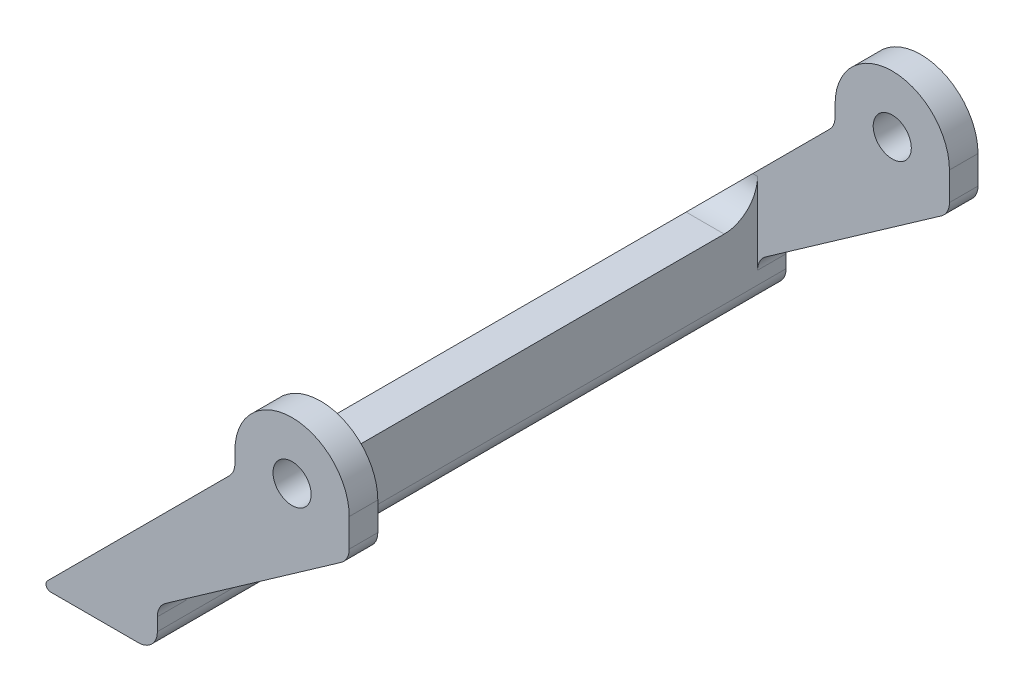
ISO-10303-21;
HEADER;
FILE_DESCRIPTION(('STEP AP214'),'2;1');
FILE_NAME('part.step','',(''),(''),'','','');
FILE_SCHEMA(('AUTOMOTIVE_DESIGN { 1 0 10303 214 1 1 1 1 }'));
ENDSEC;
DATA;
#1=APPLICATION_CONTEXT('core data for automotive mechanical design processes');
#2=APPLICATION_PROTOCOL_DEFINITION('international standard','automotive_design',2000,#1);
#3=PRODUCT_CONTEXT('',#1,'mechanical');
#4=PRODUCT('Part','Part','',(#3));
#5=PRODUCT_RELATED_PRODUCT_CATEGORY('part','',(#4));
#6=PRODUCT_DEFINITION_FORMATION('','',#4);
#7=PRODUCT_DEFINITION_CONTEXT('part definition',#1,'design');
#8=PRODUCT_DEFINITION('design','',#6,#7);
#9=PRODUCT_DEFINITION_SHAPE('','',#8);
#10=(LENGTH_UNIT() NAMED_UNIT(*) SI_UNIT(.MILLI.,.METRE.));
#11=(NAMED_UNIT(*) PLANE_ANGLE_UNIT() SI_UNIT($,.RADIAN.));
#12=(NAMED_UNIT(*) SI_UNIT($,.STERADIAN.) SOLID_ANGLE_UNIT());
#13=UNCERTAINTY_MEASURE_WITH_UNIT(LENGTH_MEASURE(1.E-05),#10,'distance_accuracy_value','');
#14=(GEOMETRIC_REPRESENTATION_CONTEXT(3) GLOBAL_UNCERTAINTY_ASSIGNED_CONTEXT((#13)) GLOBAL_UNIT_ASSIGNED_CONTEXT((#10,
#11,#12)) REPRESENTATION_CONTEXT('',''));
#15=CARTESIAN_POINT('',(0.,0.,0.));
#16=DIRECTION('',(0.,0.,1.));
#17=DIRECTION('',(1.,0.,0.));
#18=AXIS2_PLACEMENT_3D('',#15,#16,#17);
#19=CARTESIAN_POINT('',(3.336733742684,8.94083562968923,3.));
#20=DIRECTION('',(0.,0.,-1.));
#21=DIRECTION('',(-1.,0.,0.));
#22=AXIS2_PLACEMENT_3D('',#19,#20,#21);
#23=CYLINDRICAL_SURFACE('',#22,6.00000000000001);
#24=CARTESIAN_POINT('',(3.336733742684,8.94083562968923,0.));
#25=DIRECTION('',(0.,0.,1.));
#26=DIRECTION('',(-1.,0.,0.));
#27=AXIS2_PLACEMENT_3D('',#24,#25,#26);
#28=CIRCLE('',#27,6.00000000000001);
#29=CARTESIAN_POINT('',(9.33673374268399,8.94083562968921,0.));
#30=VERTEX_POINT('',#29);
#31=CARTESIAN_POINT('',(-2.66326625731602,8.94083562968921,0.));
#32=VERTEX_POINT('',#31);
#33=EDGE_CURVE('E255',#30,#32,#28,.T.);
#34=ORIENTED_EDGE('',*,*,#33,.T.);
#35=DIRECTION('',(0.,0.,-1.));
#36=VECTOR('',#35,1.);
#37=CARTESIAN_POINT('',(-2.66326625731602,8.94083562968921,3.));
#38=LINE('',#37,#36);
#39=CARTESIAN_POINT('',(-2.66326625731602,8.94083562968921,3.));
#40=VERTEX_POINT('',#39);
#41=EDGE_CURVE('E285',#40,#32,#38,.T.);
#42=ORIENTED_EDGE('',*,*,#41,.F.);
#43=CARTESIAN_POINT('',(3.336733742684,8.94083562968923,3.));
#44=DIRECTION('',(0.,0.,1.));
#45=DIRECTION('',(-1.,0.,0.));
#46=AXIS2_PLACEMENT_3D('',#43,#44,#45);
#47=CIRCLE('',#46,6.00000000000001);
#48=CARTESIAN_POINT('',(9.33673374268399,8.94083562968921,3.));
#49=VERTEX_POINT('',#48);
#50=EDGE_CURVE('E256',#49,#40,#47,.T.);
#51=ORIENTED_EDGE('',*,*,#50,.F.);
#52=DIRECTION('',(0.,0.,-1.));
#53=VECTOR('',#52,1.);
#54=CARTESIAN_POINT('',(9.33673374268399,8.94083562968921,3.));
#55=LINE('',#54,#53);
#56=EDGE_CURVE('E271',#49,#30,#55,.T.);
#57=ORIENTED_EDGE('',*,*,#56,.T.);
#58=EDGE_LOOP('',(#34,#42,#51,#57));
#59=FACE_BOUND('',#58,.T.);
#60=ADVANCED_FACE('F32',(#59),#23,.T.);
#61=CARTESIAN_POINT('',(-2.663266257316,6.93870000595819,3.));
#62=DIRECTION('',(1.,0.,0.));
#63=DIRECTION('',(0.,1.,0.));
#64=AXIS2_PLACEMENT_3D('',#61,#62,#63);
#65=PLANE('',#64);
#66=DIRECTION('',(0.,-1.,0.));
#67=VECTOR('',#66,1.);
#68=CARTESIAN_POINT('',(-2.663266257316,6.93870000595819,0.));
#69=LINE('',#68,#67);
#70=CARTESIAN_POINT('',(-2.66326625731601,7.7671271307044,0.));
#71=VERTEX_POINT('',#70);
#72=EDGE_CURVE('E274',#32,#71,#69,.T.);
#73=ORIENTED_EDGE('',*,*,#72,.T.);
#74=DIRECTION('',(0.,0.,-1.));
#75=VECTOR('',#74,1.);
#76=CARTESIAN_POINT('',(-2.66326625731601,7.7671271307044,3.));
#77=LINE('',#76,#75);
#78=CARTESIAN_POINT('',(-2.66326625731601,7.7671271307044,3.));
#79=VERTEX_POINT('',#78);
#80=EDGE_CURVE('E333',#71,#79,#77,.F.);
#81=ORIENTED_EDGE('',*,*,#80,.T.);
#82=DIRECTION('',(0.,-1.,0.));
#83=VECTOR('',#82,1.);
#84=CARTESIAN_POINT('',(-2.663266257316,6.93870000595819,3.));
#85=LINE('',#84,#83);
#86=EDGE_CURVE('E259',#40,#79,#85,.T.);
#87=ORIENTED_EDGE('',*,*,#86,.F.);
#88=ORIENTED_EDGE('',*,*,#41,.T.);
#89=EDGE_LOOP('',(#73,#81,#87,#88));
#90=FACE_BOUND('',#89,.T.);
#91=ADVANCED_FACE('F420',(#90),#65,.F.);
#92=CARTESIAN_POINT('',(-14.803266257316,-5.20129999404168,3.));
#93=DIRECTION('',(0.707106781186544,-0.707106781186551,0.));
#94=DIRECTION('',(0.707106781186551,0.707106781186544,0.));
#95=AXIS2_PLACEMENT_3D('',#92,#93,#94);
#96=PLANE('',#95);
#97=DIRECTION('',(-0.707106781186551,-0.707106781186544,0.));
#98=VECTOR('',#97,1.);
#99=CARTESIAN_POINT('',(-14.803266257316,-5.20129999404168,0.));
#100=LINE('',#99,#98);
#101=CARTESIAN_POINT('',(-3.24905269494292,6.35291356833128,0.));
#102=VERTEX_POINT('',#101);
#103=CARTESIAN_POINT('',(-22.3446059567228,-12.7426396934484,0.));
#104=VERTEX_POINT('',#103);
#105=EDGE_CURVE('E277',#102,#104,#100,.T.);
#106=ORIENTED_EDGE('',*,*,#105,.T.);
#107=DIRECTION('',(0.,0.,-1.));
#108=VECTOR('',#107,1.);
#109=CARTESIAN_POINT('',(-22.3446059567228,-12.7426396934484,3.));
#110=LINE('',#109,#108);
#111=CARTESIAN_POINT('',(-22.3446059567228,-12.7426396934484,66.));
#112=VERTEX_POINT('',#111);
#113=EDGE_CURVE('E351',#104,#112,#110,.F.);
#114=ORIENTED_EDGE('',*,*,#113,.T.);
#115=DIRECTION('',(-0.707106781186551,-0.707106781186544,0.));
#116=VECTOR('',#115,1.);
#117=CARTESIAN_POINT('',(-23.1981593473161,-13.5961930840417,66.));
#118=LINE('',#117,#116);
#119=CARTESIAN_POINT('',(-3.24905269494292,6.35291356833128,66.));
#120=VERTEX_POINT('',#119);
#121=EDGE_CURVE('E237',#120,#112,#118,.T.);
#122=ORIENTED_EDGE('',*,*,#121,.F.);
#123=DIRECTION('',(0.,0.,1.));
#124=VECTOR('',#123,1.);
#125=CARTESIAN_POINT('',(-3.24905269494292,6.35291356833128,3.));
#126=LINE('',#125,#124);
#127=CARTESIAN_POINT('',(-3.24905269494292,6.35291356833128,63.));
#128=VERTEX_POINT('',#127);
#129=EDGE_CURVE('E328',#120,#128,#126,.F.);
#130=ORIENTED_EDGE('',*,*,#129,.T.);
#131=DIRECTION('',(-0.707106781186551,-0.707106781186544,0.));
#132=VECTOR('',#131,1.);
#133=CARTESIAN_POINT('',(-14.803266257316,-5.20129999404168,63.));
#134=LINE('',#133,#132);
#135=CARTESIAN_POINT('',(-11.303266257316,-1.70129999404168,63.));
#136=VERTEX_POINT('',#135);
#137=EDGE_CURVE('E234',#128,#136,#134,.T.);
#138=ORIENTED_EDGE('',*,*,#137,.T.);
#139=CARTESIAN_POINT('',(-11.303266257316,-1.70129999404168,59.5));
#140=DIRECTION('',(0.707106781186544,-0.707106781186551,0.));
#141=DIRECTION('',(0.707106781186551,0.707106781186544,0.));
#142=AXIS2_PLACEMENT_3D('',#139,#140,#141);
#143=ELLIPSE('',#142,4.94974746830586,3.5);
#144=CARTESIAN_POINT('',(-14.803266257316,-5.20129999404168,59.5));
#145=VERTEX_POINT('',#144);
#146=EDGE_CURVE('E307',#136,#145,#143,.T.);
#147=ORIENTED_EDGE('',*,*,#146,.T.);
#148=DIRECTION('',(0.,0.,-1.));
#149=VECTOR('',#148,1.);
#150=CARTESIAN_POINT('',(-14.803266257316,-5.20129999404168,66.));
#151=LINE('',#150,#149);
#152=CARTESIAN_POINT('',(-14.803266257316,-5.20129999404168,6.5));
#153=VERTEX_POINT('',#152);
#154=EDGE_CURVE('E246',#145,#153,#151,.T.);
#155=ORIENTED_EDGE('',*,*,#154,.T.);
#156=CARTESIAN_POINT('',(-11.303266257316,-1.70129999404168,6.5));
#157=DIRECTION('',(0.707106781186544,-0.707106781186551,0.));
#158=DIRECTION('',(-0.707106781186551,-0.707106781186544,0.));
#159=AXIS2_PLACEMENT_3D('',#156,#157,#158);
#160=ELLIPSE('',#159,4.94974746830586,3.5);
#161=CARTESIAN_POINT('',(-11.303266257316,-1.70129999404168,3.));
#162=VERTEX_POINT('',#161);
#163=EDGE_CURVE('E301',#153,#162,#160,.T.);
#164=ORIENTED_EDGE('',*,*,#163,.T.);
#165=DIRECTION('',(-0.707106781186551,-0.707106781186544,0.));
#166=VECTOR('',#165,1.);
#167=CARTESIAN_POINT('',(-14.803266257316,-5.20129999404168,3.));
#168=LINE('',#167,#166);
#169=CARTESIAN_POINT('',(-3.24905269494292,6.35291356833128,3.));
#170=VERTEX_POINT('',#169);
#171=EDGE_CURVE('E263',#170,#162,#168,.T.);
#172=ORIENTED_EDGE('',*,*,#171,.F.);
#173=DIRECTION('',(0.,0.,-1.));
#174=VECTOR('',#173,1.);
#175=CARTESIAN_POINT('',(-3.24905269494292,6.35291356833128,0.));
#176=LINE('',#175,#174);
#177=EDGE_CURVE('E330',#170,#102,#176,.T.);
#178=ORIENTED_EDGE('',*,*,#177,.T.);
#179=EDGE_LOOP('',(#106,#114,#122,#130,#138,#147,#155,#164,#172,#178));
#180=FACE_BOUND('',#179,.T.);
#181=ADVANCED_FACE('F426',(#180),#96,.F.);
#182=CARTESIAN_POINT('',(9.336733742684,4.94083562968922,3.));
#183=DIRECTION('',(-0.574665383208899,0.818388475811683,0.));
#184=DIRECTION('',(-0.818388475811683,-0.574665383208899,0.));
#185=AXIS2_PLACEMENT_3D('',#182,#183,#184);
#186=PLANE('',#185);
#187=DIRECTION('',(0.818388475811683,0.574665383208899,0.));
#188=VECTOR('',#187,1.);
#189=CARTESIAN_POINT('',(9.336733742684,4.94083562968922,3.));
#190=LINE('',#189,#188);
#191=CARTESIAN_POINT('',(-9.9525970237338,-8.60396733901413,3.));
#192=VERTEX_POINT('',#191);
#193=CARTESIAN_POINT('',(8.4860645091018,4.34350297466168,3.));
#194=VERTEX_POINT('',#193);
#195=EDGE_CURVE('E267',#192,#194,#190,.T.);
#196=ORIENTED_EDGE('',*,*,#195,.F.);
#197=DIRECTION('',(0.,0.,-1.));
#198=VECTOR('',#197,1.);
#199=CARTESIAN_POINT('',(-9.9525970237338,-8.60396733901413,0.));
#200=LINE('',#199,#198);
#201=CARTESIAN_POINT('',(-9.9525970237338,-8.60396733901413,0.));
#202=VERTEX_POINT('',#201);
#203=EDGE_CURVE('E355',#192,#202,#200,.T.);
#204=ORIENTED_EDGE('',*,*,#203,.T.);
#205=DIRECTION('',(0.818388475811683,0.574665383208899,0.));
#206=VECTOR('',#205,1.);
#207=CARTESIAN_POINT('',(9.336733742684,4.94083562968922,0.));
#208=LINE('',#207,#206);
#209=CARTESIAN_POINT('',(8.4860645091018,4.34350297466168,0.));
#210=VERTEX_POINT('',#209);
#211=EDGE_CURVE('E280',#202,#210,#208,.T.);
#212=ORIENTED_EDGE('',*,*,#211,.T.);
#213=DIRECTION('',(0.,0.,-1.));
#214=VECTOR('',#213,1.);
#215=CARTESIAN_POINT('',(8.4860645091018,4.34350297466168,3.));
#216=LINE('',#215,#214);
#217=EDGE_CURVE('E315',#210,#194,#216,.F.);
#218=ORIENTED_EDGE('',*,*,#217,.T.);
#219=EDGE_LOOP('',(#196,#204,#212,#218));
#220=FACE_BOUND('',#219,.T.);
#221=ADVANCED_FACE('F511',(#220),#186,.F.);
#222=CARTESIAN_POINT('',(9.336733742684,4.94083562968922,3.));
#223=DIRECTION('',(-1.,0.,0.));
#224=DIRECTION('',(0.,-1.,0.));
#225=AXIS2_PLACEMENT_3D('',#222,#223,#224);
#226=PLANE('',#225);
#227=DIRECTION('',(0.,1.,0.));
#228=VECTOR('',#227,1.);
#229=CARTESIAN_POINT('',(9.336733742684,4.94083562968922,3.));
#230=LINE('',#229,#228);
#231=CARTESIAN_POINT('',(9.336733742684,5.98027992628505,3.));
#232=VERTEX_POINT('',#231);
#233=EDGE_CURVE('E269',#232,#49,#230,.T.);
#234=ORIENTED_EDGE('',*,*,#233,.F.);
#235=DIRECTION('',(0.,0.,-1.));
#236=VECTOR('',#235,1.);
#237=CARTESIAN_POINT('',(9.336733742684,5.98027992628505,3.));
#238=LINE('',#237,#236);
#239=CARTESIAN_POINT('',(9.336733742684,5.98027992628505,0.));
#240=VERTEX_POINT('',#239);
#241=EDGE_CURVE('E309',#232,#240,#238,.T.);
#242=ORIENTED_EDGE('',*,*,#241,.T.);
#243=DIRECTION('',(0.,1.,0.));
#244=VECTOR('',#243,1.);
#245=CARTESIAN_POINT('',(9.336733742684,4.94083562968922,0.));
#246=LINE('',#245,#244);
#247=EDGE_CURVE('E260',#240,#30,#246,.T.);
#248=ORIENTED_EDGE('',*,*,#247,.T.);
#249=ORIENTED_EDGE('',*,*,#56,.F.);
#250=EDGE_LOOP('',(#234,#242,#248,#249));
#251=FACE_BOUND('',#250,.T.);
#252=ADVANCED_FACE('F519',(#251),#226,.F.);
#253=CARTESIAN_POINT('',(3.336733742684,8.94083562968923,3.));
#254=DIRECTION('',(0.,0.,-1.));
#255=DIRECTION('',(-1.,0.,0.));
#256=AXIS2_PLACEMENT_3D('',#253,#254,#255);
#257=PLANE('',#256);
#258=CARTESIAN_POINT('',(3.33673374268399,8.94083562968921,3.));
#259=DIRECTION('',(0.,0.,1.));
#260=DIRECTION('',(1.,0.,0.));
#261=AXIS2_PLACEMENT_3D('',#258,#259,#260);
#262=CIRCLE('',#261,2.);
#263=CARTESIAN_POINT('',(5.33673374268399,8.94083562968921,3.));
#264=VERTEX_POINT('',#263);
#265=EDGE_CURVE('E396',#264,#264,#262,.T.);
#266=ORIENTED_EDGE('',*,*,#265,.F.);
#267=EDGE_LOOP('',(#266));
#268=FACE_BOUND('',#267,.T.);
#269=DIRECTION('',(0.,-1.,0.));
#270=VECTOR('',#269,1.);
#271=CARTESIAN_POINT('',(-10.803266257316,-5.20129999404168,3.));
#272=LINE('',#271,#270);
#273=CARTESIAN_POINT('',(-10.803266257316,-1.70129999404168,3.));
#274=VERTEX_POINT('',#273);
#275=CARTESIAN_POINT('',(-10.803266257316,-10.2407442906375,3.));
#276=VERTEX_POINT('',#275);
#277=EDGE_CURVE('E265',#274,#276,#272,.T.);
#278=ORIENTED_EDGE('',*,*,#277,.T.);
#279=CARTESIAN_POINT('',(-8.803266257316,-10.2407442906375,3.));
#280=DIRECTION('',(0.,0.,-1.));
#281=DIRECTION('',(-1.,0.,0.));
#282=AXIS2_PLACEMENT_3D('',#279,#280,#281);
#283=CIRCLE('',#282,2.);
#284=EDGE_CURVE('E375',#276,#192,#283,.T.);
#285=ORIENTED_EDGE('',*,*,#284,.T.);
#286=ORIENTED_EDGE('',*,*,#195,.T.);
#287=CARTESIAN_POINT('',(7.336733742684,5.98027992628504,3.));
#288=DIRECTION('',(0.,0.,-1.));
#289=DIRECTION('',(-1.,0.,0.));
#290=AXIS2_PLACEMENT_3D('',#287,#288,#289);
#291=CIRCLE('',#290,2.);
#292=EDGE_CURVE('E318',#194,#232,#291,.F.);
#293=ORIENTED_EDGE('',*,*,#292,.T.);
#294=ORIENTED_EDGE('',*,*,#233,.T.);
#295=ORIENTED_EDGE('',*,*,#50,.T.);
#296=ORIENTED_EDGE('',*,*,#86,.T.);
#297=CARTESIAN_POINT('',(-4.66326625731601,7.76712713070438,3.));
#298=DIRECTION('',(0.,0.,-1.));
#299=DIRECTION('',(-1.,0.,0.));
#300=AXIS2_PLACEMENT_3D('',#297,#298,#299);
#301=CIRCLE('',#300,2.);
#302=EDGE_CURVE('E340',#79,#170,#301,.T.);
#303=ORIENTED_EDGE('',*,*,#302,.T.);
#304=ORIENTED_EDGE('',*,*,#171,.T.);
#305=DIRECTION('',(1.,0.,0.));
#306=VECTOR('',#305,1.);
#307=CARTESIAN_POINT('',(-10.803266257316,-1.70129999404168,3.));
#308=LINE('',#307,#306);
#309=EDGE_CURVE('E288',#162,#274,#308,.T.);
#310=ORIENTED_EDGE('',*,*,#309,.T.);
#311=EDGE_LOOP('',(#278,#285,#286,#293,#294,#295,#296,#303,#304,#310));
#312=FACE_BOUND('',#311,.T.);
#313=ADVANCED_FACE('F499',(#268,#312),#257,.F.);
#314=CARTESIAN_POINT('',(3.336733742684,8.94083562968923,0.));
#315=DIRECTION('',(0.,0.,-1.));
#316=DIRECTION('',(-1.,0.,0.));
#317=AXIS2_PLACEMENT_3D('',#314,#315,#316);
#318=PLANE('',#317);
#319=CARTESIAN_POINT('',(3.33673374268399,8.94083562968921,0.));
#320=DIRECTION('',(0.,0.,-1.));
#321=DIRECTION('',(-1.,0.,0.));
#322=AXIS2_PLACEMENT_3D('',#319,#320,#321);
#323=CIRCLE('',#322,2.);
#324=CARTESIAN_POINT('',(1.33673374268399,8.94083562968921,0.));
#325=VERTEX_POINT('',#324);
#326=EDGE_CURVE('E228',#325,#325,#323,.F.);
#327=ORIENTED_EDGE('',*,*,#326,.T.);
#328=EDGE_LOOP('',(#327));
#329=FACE_BOUND('',#328,.T.);
#330=DIRECTION('',(0.,1.,0.));
#331=VECTOR('',#330,1.);
#332=CARTESIAN_POINT('',(-10.803266257316,-5.20129999404168,0.));
#333=LINE('',#332,#331);
#334=CARTESIAN_POINT('',(-10.803266257316,-11.5961930840417,0.));
#335=VERTEX_POINT('',#334);
#336=CARTESIAN_POINT('',(-10.803266257316,-10.2407442906375,0.));
#337=VERTEX_POINT('',#336);
#338=EDGE_CURVE('E241',#335,#337,#333,.T.);
#339=ORIENTED_EDGE('',*,*,#338,.F.);
#340=CARTESIAN_POINT('',(-12.803266257316,-11.5961930840417,0.));
#341=DIRECTION('',(0.,0.,-1.));
#342=DIRECTION('',(-1.,0.,0.));
#343=AXIS2_PLACEMENT_3D('',#340,#341,#342);
#344=CIRCLE('',#343,2.);
#345=CARTESIAN_POINT('',(-12.803266257316,-13.5961930840417,0.));
#346=VERTEX_POINT('',#345);
#347=EDGE_CURVE('E55',#335,#346,#344,.T.);
#348=ORIENTED_EDGE('',*,*,#347,.T.);
#349=DIRECTION('',(1.,0.,0.));
#350=VECTOR('',#349,1.);
#351=CARTESIAN_POINT('',(-10.803266257316,-13.5961930840417,0.));
#352=LINE('',#351,#350);
#353=CARTESIAN_POINT('',(-21.9910525661295,-13.5961930840417,0.));
#354=VERTEX_POINT('',#353);
#355=EDGE_CURVE('E235',#354,#346,#352,.T.);
#356=ORIENTED_EDGE('',*,*,#355,.F.);
#357=CARTESIAN_POINT('',(-21.9910525661295,-13.0961930840417,0.));
#358=DIRECTION('',(0.,0.,-1.));
#359=DIRECTION('',(-1.,0.,0.));
#360=AXIS2_PLACEMENT_3D('',#357,#358,#359);
#361=CIRCLE('',#360,0.5);
#362=EDGE_CURVE('E349',#354,#104,#361,.T.);
#363=ORIENTED_EDGE('',*,*,#362,.T.);
#364=ORIENTED_EDGE('',*,*,#105,.F.);
#365=CARTESIAN_POINT('',(-4.66326625731601,7.76712713070438,0.));
#366=DIRECTION('',(0.,0.,-1.));
#367=DIRECTION('',(-1.,0.,0.));
#368=AXIS2_PLACEMENT_3D('',#365,#366,#367);
#369=CIRCLE('',#368,2.);
#370=EDGE_CURVE('E338',#102,#71,#369,.F.);
#371=ORIENTED_EDGE('',*,*,#370,.T.);
#372=ORIENTED_EDGE('',*,*,#72,.F.);
#373=ORIENTED_EDGE('',*,*,#33,.F.);
#374=ORIENTED_EDGE('',*,*,#247,.F.);
#375=CARTESIAN_POINT('',(7.336733742684,5.98027992628504,0.));
#376=DIRECTION('',(0.,0.,-1.));
#377=DIRECTION('',(-1.,0.,0.));
#378=AXIS2_PLACEMENT_3D('',#375,#376,#377);
#379=CIRCLE('',#378,2.);
#380=EDGE_CURVE('E312',#240,#210,#379,.T.);
#381=ORIENTED_EDGE('',*,*,#380,.T.);
#382=ORIENTED_EDGE('',*,*,#211,.F.);
#383=CARTESIAN_POINT('',(-8.803266257316,-10.2407442906375,0.));
#384=DIRECTION('',(0.,0.,-1.));
#385=DIRECTION('',(-1.,0.,0.));
#386=AXIS2_PLACEMENT_3D('',#383,#384,#385);
#387=CIRCLE('',#386,2.);
#388=EDGE_CURVE('E373',#202,#337,#387,.F.);
#389=ORIENTED_EDGE('',*,*,#388,.T.);
#390=EDGE_LOOP('',(#339,#348,#356,#363,#364,#371,#372,#373,#374,#381,#382,#389));
#391=FACE_BOUND('',#390,.T.);
#392=ADVANCED_FACE('F491',(#329,#391),#318,.T.);
#393=CARTESIAN_POINT('',(-10.803266257316,-5.20129999404168,66.));
#394=DIRECTION('',(-1.,0.,0.));
#395=DIRECTION('',(0.,-1.,0.));
#396=AXIS2_PLACEMENT_3D('',#393,#394,#395);
#397=PLANE('',#396);
#398=ORIENTED_EDGE('',*,*,#338,.T.);
#399=DIRECTION('',(0.,0.,-1.));
#400=VECTOR('',#399,1.);
#401=CARTESIAN_POINT('',(-10.803266257316,-10.2407442906375,3.));
#402=LINE('',#401,#400);
#403=EDGE_CURVE('E364',#337,#276,#402,.F.);
#404=ORIENTED_EDGE('',*,*,#403,.T.);
#405=ORIENTED_EDGE('',*,*,#277,.F.);
#406=CARTESIAN_POINT('',(-10.803266257316,-1.70129999404168,6.5));
#407=DIRECTION('',(-1.,0.,0.));
#408=DIRECTION('',(0.,-1.,0.));
#409=AXIS2_PLACEMENT_3D('',#406,#407,#408);
#410=CIRCLE('',#409,3.5);
#411=CARTESIAN_POINT('',(-10.803266257316,-5.20129999404168,6.5));
#412=VERTEX_POINT('',#411);
#413=EDGE_CURVE('E299',#274,#412,#410,.T.);
#414=ORIENTED_EDGE('',*,*,#413,.T.);
#415=DIRECTION('',(0.,0.,-1.));
#416=VECTOR('',#415,1.);
#417=CARTESIAN_POINT('',(-10.803266257316,-5.20129999404168,66.));
#418=LINE('',#417,#416);
#419=CARTESIAN_POINT('',(-10.803266257316,-5.20129999404168,59.5));
#420=VERTEX_POINT('',#419);
#421=EDGE_CURVE('E252',#420,#412,#418,.T.);
#422=ORIENTED_EDGE('',*,*,#421,.F.);
#423=CARTESIAN_POINT('',(-10.803266257316,-1.70129999404168,59.5));
#424=DIRECTION('',(-1.,0.,0.));
#425=DIRECTION('',(0.,-1.,0.));
#426=AXIS2_PLACEMENT_3D('',#423,#424,#425);
#427=CIRCLE('',#426,3.5);
#428=CARTESIAN_POINT('',(-10.803266257316,-1.70129999404168,63.));
#429=VERTEX_POINT('',#428);
#430=EDGE_CURVE('E304',#420,#429,#427,.T.);
#431=ORIENTED_EDGE('',*,*,#430,.T.);
#432=DIRECTION('',(0.,-1.,0.));
#433=VECTOR('',#432,1.);
#434=CARTESIAN_POINT('',(-10.803266257316,-5.20129999404168,63.));
#435=LINE('',#434,#433);
#436=CARTESIAN_POINT('',(-10.803266257316,-10.2407442906375,63.));
#437=VERTEX_POINT('',#436);
#438=EDGE_CURVE('E390',#429,#437,#435,.T.);
#439=ORIENTED_EDGE('',*,*,#438,.T.);
#440=DIRECTION('',(0.,0.,1.));
#441=VECTOR('',#440,1.);
#442=CARTESIAN_POINT('',(-10.803266257316,-10.2407442906375,66.));
#443=LINE('',#442,#441);
#444=CARTESIAN_POINT('',(-10.803266257316,-10.2407442906375,66.));
#445=VERTEX_POINT('',#444);
#446=EDGE_CURVE('E361',#437,#445,#443,.T.);
#447=ORIENTED_EDGE('',*,*,#446,.T.);
#448=DIRECTION('',(0.,1.,0.));
#449=VECTOR('',#448,1.);
#450=CARTESIAN_POINT('',(-10.803266257316,-5.20129999404168,66.));
#451=LINE('',#450,#449);
#452=CARTESIAN_POINT('',(-10.803266257316,-11.5961930840417,66.));
#453=VERTEX_POINT('',#452);
#454=EDGE_CURVE('E243',#453,#445,#451,.T.);
#455=ORIENTED_EDGE('',*,*,#454,.F.);
#456=DIRECTION('',(0.,0.,-1.));
#457=VECTOR('',#456,1.);
#458=CARTESIAN_POINT('',(-10.803266257316,-11.5961930840417,66.));
#459=LINE('',#458,#457);
#460=EDGE_CURVE('E358',#453,#335,#459,.T.);
#461=ORIENTED_EDGE('',*,*,#460,.T.);
#462=EDGE_LOOP('',(#398,#404,#405,#414,#422,#431,#439,#447,#455,#461));
#463=FACE_BOUND('',#462,.T.);
#464=ADVANCED_FACE('F472',(#463),#397,.F.);
#465=CARTESIAN_POINT('',(-14.803266257316,-5.20129999404168,66.));
#466=DIRECTION('',(0.,-1.,0.));
#467=DIRECTION('',(1.,0.,0.));
#468=AXIS2_PLACEMENT_3D('',#465,#466,#467);
#469=PLANE('',#468);
#470=ORIENTED_EDGE('',*,*,#421,.T.);
#471=DIRECTION('',(1.,0.,0.));
#472=VECTOR('',#471,1.);
#473=CARTESIAN_POINT('',(-14.803266257316,-5.20129999404168,6.5));
#474=LINE('',#473,#472);
#475=EDGE_CURVE('E294',#412,#153,#474,.F.);
#476=ORIENTED_EDGE('',*,*,#475,.T.);
#477=ORIENTED_EDGE('',*,*,#154,.F.);
#478=DIRECTION('',(1.,0.,0.));
#479=VECTOR('',#478,1.);
#480=CARTESIAN_POINT('',(-14.803266257316,-5.20129999404168,59.5));
#481=LINE('',#480,#479);
#482=EDGE_CURVE('E291',#145,#420,#481,.T.);
#483=ORIENTED_EDGE('',*,*,#482,.T.);
#484=EDGE_LOOP('',(#470,#476,#477,#483));
#485=FACE_BOUND('',#484,.T.);
#486=ADVANCED_FACE('F571',(#485),#469,.F.);
#487=CARTESIAN_POINT('',(-10.803266257316,-13.5961930840417,66.));
#488=DIRECTION('',(0.,1.,0.));
#489=DIRECTION('',(-1.,0.,0.));
#490=AXIS2_PLACEMENT_3D('',#487,#488,#489);
#491=PLANE('',#490);
#492=ORIENTED_EDGE('',*,*,#355,.T.);
#493=DIRECTION('',(0.,0.,-1.));
#494=VECTOR('',#493,1.);
#495=CARTESIAN_POINT('',(-12.803266257316,-13.5961930840417,66.));
#496=LINE('',#495,#494);
#497=CARTESIAN_POINT('',(-12.803266257316,-13.5961930840417,66.));
#498=VERTEX_POINT('',#497);
#499=EDGE_CURVE('E47',#346,#498,#496,.F.);
#500=ORIENTED_EDGE('',*,*,#499,.T.);
#501=DIRECTION('',(1.,0.,0.));
#502=VECTOR('',#501,1.);
#503=CARTESIAN_POINT('',(-10.803266257316,-13.5961930840417,66.));
#504=LINE('',#503,#502);
#505=CARTESIAN_POINT('',(-21.9910525661295,-13.5961930840417,66.));
#506=VERTEX_POINT('',#505);
#507=EDGE_CURVE('E240',#506,#498,#504,.T.);
#508=ORIENTED_EDGE('',*,*,#507,.F.);
#509=DIRECTION('',(0.,0.,-1.));
#510=VECTOR('',#509,1.);
#511=CARTESIAN_POINT('',(-21.9910525661295,-13.5961930840417,66.));
#512=LINE('',#511,#510);
#513=EDGE_CURVE('E346',#506,#354,#512,.T.);
#514=ORIENTED_EDGE('',*,*,#513,.T.);
#515=EDGE_LOOP('',(#492,#500,#508,#514));
#516=FACE_BOUND('',#515,.T.);
#517=ADVANCED_FACE('F490',(#516),#491,.F.);
#518=CARTESIAN_POINT('',(-10.803266257316,-1.20129999404172,66.));
#519=DIRECTION('',(0.,0.,-1.));
#520=DIRECTION('',(-1.,0.,0.));
#521=AXIS2_PLACEMENT_3D('',#518,#519,#520);
#522=PLANE('',#521);
#523=CARTESIAN_POINT('',(3.33673374268399,8.94083562968921,66.));
#524=DIRECTION('',(0.,0.,-1.));
#525=DIRECTION('',(-1.,0.,0.));
#526=AXIS2_PLACEMENT_3D('',#523,#524,#525);
#527=CIRCLE('',#526,2.);
#528=CARTESIAN_POINT('',(1.33673374268399,8.94083562968921,66.));
#529=VERTEX_POINT('',#528);
#530=EDGE_CURVE('E399',#529,#529,#527,.F.);
#531=ORIENTED_EDGE('',*,*,#530,.F.);
#532=EDGE_LOOP('',(#531));
#533=FACE_BOUND('',#532,.T.);
#534=ORIENTED_EDGE('',*,*,#507,.T.);
#535=CARTESIAN_POINT('',(-12.803266257316,-11.5961930840417,66.));
#536=DIRECTION('',(0.,0.,-1.));
#537=DIRECTION('',(-1.,0.,0.));
#538=AXIS2_PLACEMENT_3D('',#535,#536,#537);
#539=CIRCLE('',#538,2.);
#540=EDGE_CURVE('E371',#498,#453,#539,.F.);
#541=ORIENTED_EDGE('',*,*,#540,.T.);
#542=ORIENTED_EDGE('',*,*,#454,.T.);
#543=CARTESIAN_POINT('',(-8.803266257316,-10.2407442906375,66.));
#544=DIRECTION('',(0.,0.,-1.));
#545=DIRECTION('',(-1.,0.,0.));
#546=AXIS2_PLACEMENT_3D('',#543,#544,#545);
#547=CIRCLE('',#546,2.);
#548=CARTESIAN_POINT('',(-9.9525970237338,-8.60396733901413,66.));
#549=VERTEX_POINT('',#548);
#550=EDGE_CURVE('E40',#445,#549,#547,.T.);
#551=ORIENTED_EDGE('',*,*,#550,.T.);
#552=DIRECTION('',(0.818388475811683,0.574665383208899,0.));
#553=VECTOR('',#552,1.);
#554=CARTESIAN_POINT('',(-10.803266257316,-9.20129999404168,66.));
#555=LINE('',#554,#553);
#556=CARTESIAN_POINT('',(8.4860645091018,4.34350297466168,66.));
#557=VERTEX_POINT('',#556);
#558=EDGE_CURVE('E225',#549,#557,#555,.T.);
#559=ORIENTED_EDGE('',*,*,#558,.T.);
#560=CARTESIAN_POINT('',(7.336733742684,5.98027992628504,66.));
#561=DIRECTION('',(0.,0.,-1.));
#562=DIRECTION('',(-1.,0.,0.));
#563=AXIS2_PLACEMENT_3D('',#560,#561,#562);
#564=CIRCLE('',#563,2.);
#565=CARTESIAN_POINT('',(9.336733742684,5.98027992628505,66.));
#566=VERTEX_POINT('',#565);
#567=EDGE_CURVE('E323',#557,#566,#564,.F.);
#568=ORIENTED_EDGE('',*,*,#567,.T.);
#569=DIRECTION('',(0.,1.,0.));
#570=VECTOR('',#569,1.);
#571=CARTESIAN_POINT('',(9.336733742684,4.94083562968922,66.));
#572=LINE('',#571,#570);
#573=CARTESIAN_POINT('',(9.33673374268399,8.94083562968921,66.));
#574=VERTEX_POINT('',#573);
#575=EDGE_CURVE('E227',#566,#574,#572,.T.);
#576=ORIENTED_EDGE('',*,*,#575,.T.);
#577=CARTESIAN_POINT('',(3.33673374268399,8.94083562968921,66.));
#578=DIRECTION('',(0.,0.,1.));
#579=DIRECTION('',(-1.,0.,0.));
#580=AXIS2_PLACEMENT_3D('',#577,#578,#579);
#581=CIRCLE('',#580,6.00000000000001);
#582=CARTESIAN_POINT('',(-2.66326625731602,8.94083562968921,66.));
#583=VERTEX_POINT('',#582);
#584=EDGE_CURVE('E215',#574,#583,#581,.T.);
#585=ORIENTED_EDGE('',*,*,#584,.T.);
#586=DIRECTION('',(0.,-1.,0.));
#587=VECTOR('',#586,1.);
#588=CARTESIAN_POINT('',(-2.663266257316,6.93870000595819,66.));
#589=LINE('',#588,#587);
#590=CARTESIAN_POINT('',(-2.66326625731601,7.7671271307044,66.));
#591=VERTEX_POINT('',#590);
#592=EDGE_CURVE('E231',#583,#591,#589,.T.);
#593=ORIENTED_EDGE('',*,*,#592,.T.);
#594=CARTESIAN_POINT('',(-4.66326625731601,7.76712713070438,66.));
#595=DIRECTION('',(0.,0.,-1.));
#596=DIRECTION('',(-1.,0.,0.));
#597=AXIS2_PLACEMENT_3D('',#594,#595,#596);
#598=CIRCLE('',#597,2.);
#599=EDGE_CURVE('E342',#591,#120,#598,.T.);
#600=ORIENTED_EDGE('',*,*,#599,.T.);
#601=ORIENTED_EDGE('',*,*,#121,.T.);
#602=CARTESIAN_POINT('',(-21.9910525661295,-13.0961930840417,66.));
#603=DIRECTION('',(0.,0.,-1.));
#604=DIRECTION('',(-1.,0.,0.));
#605=AXIS2_PLACEMENT_3D('',#602,#603,#604);
#606=CIRCLE('',#605,0.5);
#607=EDGE_CURVE('E353',#112,#506,#606,.F.);
#608=ORIENTED_EDGE('',*,*,#607,.T.);
#609=EDGE_LOOP('',(#534,#541,#542,#551,#559,#568,#576,#585,#593,#600,#601,#608));
#610=FACE_BOUND('',#609,.T.);
#611=ADVANCED_FACE('F378',(#533,#610),#522,.F.);
#612=CARTESIAN_POINT('',(-2.663266257316,6.93870000595819,63.));
#613=DIRECTION('',(-1.,0.,0.));
#614=DIRECTION('',(0.,-1.,0.));
#615=AXIS2_PLACEMENT_3D('',#612,#613,#614);
#616=PLANE('',#615);
#617=DIRECTION('',(0.,-1.,0.));
#618=VECTOR('',#617,1.);
#619=CARTESIAN_POINT('',(-2.663266257316,6.93870000595819,63.));
#620=LINE('',#619,#618);
#621=CARTESIAN_POINT('',(-2.66326625731602,8.94083562968921,63.));
#622=VERTEX_POINT('',#621);
#623=CARTESIAN_POINT('',(-2.66326625731601,7.7671271307044,63.));
#624=VERTEX_POINT('',#623);
#625=EDGE_CURVE('E217',#622,#624,#620,.T.);
#626=ORIENTED_EDGE('',*,*,#625,.T.);
#627=DIRECTION('',(0.,0.,1.));
#628=VECTOR('',#627,1.);
#629=CARTESIAN_POINT('',(-2.66326625731601,7.7671271307044,63.));
#630=LINE('',#629,#628);
#631=EDGE_CURVE('E335',#624,#591,#630,.T.);
#632=ORIENTED_EDGE('',*,*,#631,.T.);
#633=ORIENTED_EDGE('',*,*,#592,.F.);
#634=DIRECTION('',(0.,0.,1.));
#635=VECTOR('',#634,1.);
#636=CARTESIAN_POINT('',(-2.66326625731602,8.94083562968921,63.));
#637=LINE('',#636,#635);
#638=EDGE_CURVE('E216',#622,#583,#637,.T.);
#639=ORIENTED_EDGE('',*,*,#638,.F.);
#640=EDGE_LOOP('',(#626,#632,#633,#639));
#641=FACE_BOUND('',#640,.T.);
#642=ADVANCED_FACE('F484',(#641),#616,.T.);
#643=CARTESIAN_POINT('',(3.33673374268399,8.94083562968921,63.));
#644=DIRECTION('',(0.,0.,1.));
#645=DIRECTION('',(1.,0.,0.));
#646=AXIS2_PLACEMENT_3D('',#643,#644,#645);
#647=CYLINDRICAL_SURFACE('',#646,6.00000000000001);
#648=ORIENTED_EDGE('',*,*,#584,.F.);
#649=DIRECTION('',(0.,0.,1.));
#650=VECTOR('',#649,1.);
#651=CARTESIAN_POINT('',(9.33673374268399,8.94083562968921,63.));
#652=LINE('',#651,#650);
#653=CARTESIAN_POINT('',(9.33673374268399,8.94083562968921,63.));
#654=VERTEX_POINT('',#653);
#655=EDGE_CURVE('E199',#654,#574,#652,.T.);
#656=ORIENTED_EDGE('',*,*,#655,.F.);
#657=CARTESIAN_POINT('',(3.33673374268399,8.94083562968921,63.));
#658=DIRECTION('',(0.,0.,1.));
#659=DIRECTION('',(-1.,0.,0.));
#660=AXIS2_PLACEMENT_3D('',#657,#658,#659);
#661=CIRCLE('',#660,6.00000000000001);
#662=EDGE_CURVE('E207',#654,#622,#661,.T.);
#663=ORIENTED_EDGE('',*,*,#662,.T.);
#664=ORIENTED_EDGE('',*,*,#638,.T.);
#665=EDGE_LOOP('',(#648,#656,#663,#664));
#666=FACE_BOUND('',#665,.T.);
#667=ADVANCED_FACE('F212',(#666),#647,.T.);
#668=CARTESIAN_POINT('',(9.336733742684,4.94083562968922,63.));
#669=DIRECTION('',(1.,0.,0.));
#670=DIRECTION('',(0.,1.,0.));
#671=AXIS2_PLACEMENT_3D('',#668,#669,#670);
#672=PLANE('',#671);
#673=ORIENTED_EDGE('',*,*,#575,.F.);
#674=DIRECTION('',(0.,0.,1.));
#675=VECTOR('',#674,1.);
#676=CARTESIAN_POINT('',(9.336733742684,5.98027992628505,63.));
#677=LINE('',#676,#675);
#678=CARTESIAN_POINT('',(9.336733742684,5.98027992628505,63.));
#679=VERTEX_POINT('',#678);
#680=EDGE_CURVE('E202',#566,#679,#677,.F.);
#681=ORIENTED_EDGE('',*,*,#680,.T.);
#682=DIRECTION('',(0.,1.,0.));
#683=VECTOR('',#682,1.);
#684=CARTESIAN_POINT('',(9.336733742684,4.94083562968922,63.));
#685=LINE('',#684,#683);
#686=EDGE_CURVE('E195',#679,#654,#685,.T.);
#687=ORIENTED_EDGE('',*,*,#686,.T.);
#688=ORIENTED_EDGE('',*,*,#655,.T.);
#689=EDGE_LOOP('',(#673,#681,#687,#688));
#690=FACE_BOUND('',#689,.T.);
#691=ADVANCED_FACE('F198',(#690),#672,.T.);
#692=CARTESIAN_POINT('',(-10.803266257316,-9.20129999404168,63.));
#693=DIRECTION('',(0.574665383208899,-0.818388475811683,0.));
#694=DIRECTION('',(0.818388475811683,0.574665383208899,0.));
#695=AXIS2_PLACEMENT_3D('',#692,#693,#694);
#696=PLANE('',#695);
#697=ORIENTED_EDGE('',*,*,#558,.F.);
#698=DIRECTION('',(0.,0.,1.));
#699=VECTOR('',#698,1.);
#700=CARTESIAN_POINT('',(-9.9525970237338,-8.60396733901413,63.));
#701=LINE('',#700,#699);
#702=CARTESIAN_POINT('',(-9.9525970237338,-8.60396733901413,63.));
#703=VERTEX_POINT('',#702);
#704=EDGE_CURVE('E367',#549,#703,#701,.F.);
#705=ORIENTED_EDGE('',*,*,#704,.T.);
#706=DIRECTION('',(0.818388475811683,0.574665383208899,0.));
#707=VECTOR('',#706,1.);
#708=CARTESIAN_POINT('',(-10.803266257316,-9.20129999404168,63.));
#709=LINE('',#708,#707);
#710=CARTESIAN_POINT('',(8.4860645091018,4.34350297466168,63.));
#711=VERTEX_POINT('',#710);
#712=EDGE_CURVE('E208',#703,#711,#709,.T.);
#713=ORIENTED_EDGE('',*,*,#712,.T.);
#714=DIRECTION('',(0.,0.,1.));
#715=VECTOR('',#714,1.);
#716=CARTESIAN_POINT('',(8.4860645091018,4.34350297466168,63.));
#717=LINE('',#716,#715);
#718=EDGE_CURVE('E320',#711,#557,#717,.T.);
#719=ORIENTED_EDGE('',*,*,#718,.T.);
#720=EDGE_LOOP('',(#697,#705,#713,#719));
#721=FACE_BOUND('',#720,.T.);
#722=ADVANCED_FACE('F385',(#721),#696,.T.);
#723=CARTESIAN_POINT('',(3.33673374268399,8.94083562968921,63.));
#724=DIRECTION('',(0.,0.,-1.));
#725=DIRECTION('',(-1.,0.,0.));
#726=AXIS2_PLACEMENT_3D('',#723,#724,#725);
#727=PLANE('',#726);
#728=CARTESIAN_POINT('',(3.33673374268399,8.94083562968921,63.));
#729=DIRECTION('',(0.,0.,-1.));
#730=DIRECTION('',(-1.,0.,0.));
#731=AXIS2_PLACEMENT_3D('',#728,#729,#730);
#732=CIRCLE('',#731,2.);
#733=CARTESIAN_POINT('',(1.33673374268399,8.94083562968921,63.));
#734=VERTEX_POINT('',#733);
#735=EDGE_CURVE('E402',#734,#734,#732,.T.);
#736=ORIENTED_EDGE('',*,*,#735,.F.);
#737=EDGE_LOOP('',(#736));
#738=FACE_BOUND('',#737,.T.);
#739=ORIENTED_EDGE('',*,*,#686,.F.);
#740=CARTESIAN_POINT('',(7.336733742684,5.98027992628504,63.));
#741=DIRECTION('',(0.,0.,-1.));
#742=DIRECTION('',(-1.,0.,0.));
#743=AXIS2_PLACEMENT_3D('',#740,#741,#742);
#744=CIRCLE('',#743,2.);
#745=EDGE_CURVE('E326',#679,#711,#744,.T.);
#746=ORIENTED_EDGE('',*,*,#745,.T.);
#747=ORIENTED_EDGE('',*,*,#712,.F.);
#748=CARTESIAN_POINT('',(-8.803266257316,-10.2407442906375,63.));
#749=DIRECTION('',(0.,0.,-1.));
#750=DIRECTION('',(-1.,0.,0.));
#751=AXIS2_PLACEMENT_3D('',#748,#749,#750);
#752=CIRCLE('',#751,2.);
#753=EDGE_CURVE('E11',#703,#437,#752,.F.);
#754=ORIENTED_EDGE('',*,*,#753,.T.);
#755=ORIENTED_EDGE('',*,*,#438,.F.);
#756=DIRECTION('',(1.,0.,0.));
#757=VECTOR('',#756,1.);
#758=CARTESIAN_POINT('',(3.33673374268399,-1.70129999404167,63.));
#759=LINE('',#758,#757);
#760=EDGE_CURVE('E296',#429,#136,#759,.F.);
#761=ORIENTED_EDGE('',*,*,#760,.T.);
#762=ORIENTED_EDGE('',*,*,#137,.F.);
#763=CARTESIAN_POINT('',(-4.66326625731601,7.76712713070438,63.));
#764=DIRECTION('',(0.,0.,-1.));
#765=DIRECTION('',(-1.,0.,0.));
#766=AXIS2_PLACEMENT_3D('',#763,#764,#765);
#767=CIRCLE('',#766,2.);
#768=EDGE_CURVE('E344',#128,#624,#767,.F.);
#769=ORIENTED_EDGE('',*,*,#768,.T.);
#770=ORIENTED_EDGE('',*,*,#625,.F.);
#771=ORIENTED_EDGE('',*,*,#662,.F.);
#772=EDGE_LOOP('',(#739,#746,#747,#754,#755,#761,#762,#769,#770,#771));
#773=FACE_BOUND('',#772,.T.);
#774=ADVANCED_FACE('F219',(#738,#773),#727,.T.);
#775=CARTESIAN_POINT('',(3.33673374268399,8.94083562968921,-5.65685424949238));
#776=DIRECTION('',(0.,0.,1.));
#777=DIRECTION('',(1.,0.,0.));
#778=AXIS2_PLACEMENT_3D('',#775,#776,#777);
#779=CYLINDRICAL_SURFACE('',#778,2.);
#780=ORIENTED_EDGE('',*,*,#265,.T.);
#781=EDGE_LOOP('',(#780));
#782=FACE_BOUND('',#781,.T.);
#783=ORIENTED_EDGE('',*,*,#326,.F.);
#784=EDGE_LOOP('',(#783));
#785=FACE_BOUND('',#784,.T.);
#786=ADVANCED_FACE('F409',(#782,#785),#779,.F.);
#787=CARTESIAN_POINT('',(3.33673374268399,8.94083562968921,71.6568542494924));
#788=DIRECTION('',(0.,0.,-1.));
#789=DIRECTION('',(-1.,0.,0.));
#790=AXIS2_PLACEMENT_3D('',#787,#788,#789);
#791=CYLINDRICAL_SURFACE('',#790,2.);
#792=ORIENTED_EDGE('',*,*,#530,.T.);
#793=EDGE_LOOP('',(#792));
#794=FACE_BOUND('',#793,.T.);
#795=ORIENTED_EDGE('',*,*,#735,.T.);
#796=EDGE_LOOP('',(#795));
#797=FACE_BOUND('',#796,.T.);
#798=ADVANCED_FACE('F406',(#794,#797),#791,.F.);
#799=CARTESIAN_POINT('',(3.336733742684,-1.70129999404167,6.5));
#800=DIRECTION('',(-1.,0.,0.));
#801=DIRECTION('',(0.,-1.,0.));
#802=AXIS2_PLACEMENT_3D('',#799,#800,#801);
#803=CYLINDRICAL_SURFACE('',#802,3.5);
#804=ORIENTED_EDGE('',*,*,#163,.F.);
#805=ORIENTED_EDGE('',*,*,#475,.F.);
#806=ORIENTED_EDGE('',*,*,#413,.F.);
#807=ORIENTED_EDGE('',*,*,#309,.F.);
#808=EDGE_LOOP('',(#804,#805,#806,#807));
#809=FACE_BOUND('',#808,.T.);
#810=ADVANCED_FACE('F431',(#809),#803,.F.);
#811=CARTESIAN_POINT('',(-14.803266257316,-1.70129999404168,59.5));
#812=DIRECTION('',(1.,0.,0.));
#813=DIRECTION('',(0.,1.,0.));
#814=AXIS2_PLACEMENT_3D('',#811,#812,#813);
#815=CYLINDRICAL_SURFACE('',#814,3.5);
#816=ORIENTED_EDGE('',*,*,#146,.F.);
#817=ORIENTED_EDGE('',*,*,#760,.F.);
#818=ORIENTED_EDGE('',*,*,#430,.F.);
#819=ORIENTED_EDGE('',*,*,#482,.F.);
#820=EDGE_LOOP('',(#816,#817,#818,#819));
#821=FACE_BOUND('',#820,.T.);
#822=ADVANCED_FACE('F434',(#821),#815,.F.);
#823=CARTESIAN_POINT('',(7.336733742684,5.98027992628504,3.));
#824=DIRECTION('',(0.,0.,-1.));
#825=DIRECTION('',(-1.,0.,0.));
#826=AXIS2_PLACEMENT_3D('',#823,#824,#825);
#827=CYLINDRICAL_SURFACE('',#826,2.);
#828=ORIENTED_EDGE('',*,*,#292,.F.);
#829=ORIENTED_EDGE('',*,*,#217,.F.);
#830=ORIENTED_EDGE('',*,*,#380,.F.);
#831=ORIENTED_EDGE('',*,*,#241,.F.);
#832=EDGE_LOOP('',(#828,#829,#830,#831));
#833=FACE_BOUND('',#832,.T.);
#834=ADVANCED_FACE('F438',(#833),#827,.T.);
#835=CARTESIAN_POINT('',(7.336733742684,5.98027992628504,63.));
#836=DIRECTION('',(0.,0.,1.));
#837=DIRECTION('',(1.,0.,0.));
#838=AXIS2_PLACEMENT_3D('',#835,#836,#837);
#839=CYLINDRICAL_SURFACE('',#838,2.);
#840=ORIENTED_EDGE('',*,*,#745,.F.);
#841=ORIENTED_EDGE('',*,*,#680,.F.);
#842=ORIENTED_EDGE('',*,*,#567,.F.);
#843=ORIENTED_EDGE('',*,*,#718,.F.);
#844=EDGE_LOOP('',(#840,#841,#842,#843));
#845=FACE_BOUND('',#844,.T.);
#846=ADVANCED_FACE('F442',(#845),#839,.T.);
#847=CARTESIAN_POINT('',(-4.66326625731601,7.76712713070438,3.));
#848=DIRECTION('',(0.,0.,1.));
#849=DIRECTION('',(1.,0.,0.));
#850=AXIS2_PLACEMENT_3D('',#847,#848,#849);
#851=CYLINDRICAL_SURFACE('',#850,2.);
#852=ORIENTED_EDGE('',*,*,#302,.F.);
#853=ORIENTED_EDGE('',*,*,#80,.F.);
#854=ORIENTED_EDGE('',*,*,#370,.F.);
#855=ORIENTED_EDGE('',*,*,#177,.F.);
#856=EDGE_LOOP('',(#852,#853,#854,#855));
#857=FACE_BOUND('',#856,.T.);
#858=ADVANCED_FACE('F446',(#857),#851,.F.);
#859=CARTESIAN_POINT('',(-4.66326625731601,7.76712713070438,63.));
#860=DIRECTION('',(0.,0.,1.));
#861=DIRECTION('',(1.,0.,0.));
#862=AXIS2_PLACEMENT_3D('',#859,#860,#861);
#863=CYLINDRICAL_SURFACE('',#862,2.);
#864=ORIENTED_EDGE('',*,*,#768,.F.);
#865=ORIENTED_EDGE('',*,*,#129,.F.);
#866=ORIENTED_EDGE('',*,*,#599,.F.);
#867=ORIENTED_EDGE('',*,*,#631,.F.);
#868=EDGE_LOOP('',(#864,#865,#866,#867));
#869=FACE_BOUND('',#868,.T.);
#870=ADVANCED_FACE('F450',(#869),#863,.F.);
#871=CARTESIAN_POINT('',(-21.9910525661295,-13.0961930840417,66.));
#872=DIRECTION('',(0.,0.,-1.));
#873=DIRECTION('',(-1.,0.,0.));
#874=AXIS2_PLACEMENT_3D('',#871,#872,#873);
#875=CYLINDRICAL_SURFACE('',#874,0.5);
#876=ORIENTED_EDGE('',*,*,#607,.F.);
#877=ORIENTED_EDGE('',*,*,#113,.F.);
#878=ORIENTED_EDGE('',*,*,#362,.F.);
#879=ORIENTED_EDGE('',*,*,#513,.F.);
#880=EDGE_LOOP('',(#876,#877,#878,#879));
#881=FACE_BOUND('',#880,.T.);
#882=ADVANCED_FACE('F454',(#881),#875,.T.);
#883=CARTESIAN_POINT('',(-8.803266257316,-10.2407442906375,3.));
#884=DIRECTION('',(0.,0.,1.));
#885=DIRECTION('',(1.,0.,0.));
#886=AXIS2_PLACEMENT_3D('',#883,#884,#885);
#887=CYLINDRICAL_SURFACE('',#886,2.);
#888=ORIENTED_EDGE('',*,*,#284,.F.);
#889=ORIENTED_EDGE('',*,*,#403,.F.);
#890=ORIENTED_EDGE('',*,*,#388,.F.);
#891=ORIENTED_EDGE('',*,*,#203,.F.);
#892=EDGE_LOOP('',(#888,#889,#890,#891));
#893=FACE_BOUND('',#892,.T.);
#894=ADVANCED_FACE('F458',(#893),#887,.F.);
#895=CARTESIAN_POINT('',(-8.803266257316,-10.2407442906375,66.));
#896=DIRECTION('',(0.,0.,1.));
#897=DIRECTION('',(1.,0.,0.));
#898=AXIS2_PLACEMENT_3D('',#895,#896,#897);
#899=CYLINDRICAL_SURFACE('',#898,2.);
#900=ORIENTED_EDGE('',*,*,#753,.F.);
#901=ORIENTED_EDGE('',*,*,#704,.F.);
#902=ORIENTED_EDGE('',*,*,#550,.F.);
#903=ORIENTED_EDGE('',*,*,#446,.F.);
#904=EDGE_LOOP('',(#900,#901,#902,#903));
#905=FACE_BOUND('',#904,.T.);
#906=ADVANCED_FACE('F389',(#905),#899,.F.);
#907=CARTESIAN_POINT('',(-12.803266257316,-11.5961930840417,66.));
#908=DIRECTION('',(0.,0.,-1.));
#909=DIRECTION('',(-1.,0.,0.));
#910=AXIS2_PLACEMENT_3D('',#907,#908,#909);
#911=CYLINDRICAL_SURFACE('',#910,2.);
#912=ORIENTED_EDGE('',*,*,#540,.F.);
#913=ORIENTED_EDGE('',*,*,#499,.F.);
#914=ORIENTED_EDGE('',*,*,#347,.F.);
#915=ORIENTED_EDGE('',*,*,#460,.F.);
#916=EDGE_LOOP('',(#912,#913,#914,#915));
#917=FACE_BOUND('',#916,.T.);
#918=ADVANCED_FACE('F34',(#917),#911,.T.);
#919=CLOSED_SHELL('',(#60,#91,#181,#221,#252,#313,#392,#464,#486,#517,#611,#642,#667,#691,#722,
#774,#786,#798,#810,#822,#834,#846,#858,#870,#882,#894,#906,#918));
#920=MANIFOLD_SOLID_BREP('B2',#919);
#921=ADVANCED_BREP_SHAPE_REPRESENTATION('',(#18,#920),#14);
#922=SHAPE_DEFINITION_REPRESENTATION(#9,#921);
ENDSEC;
END-ISO-10303-21;
